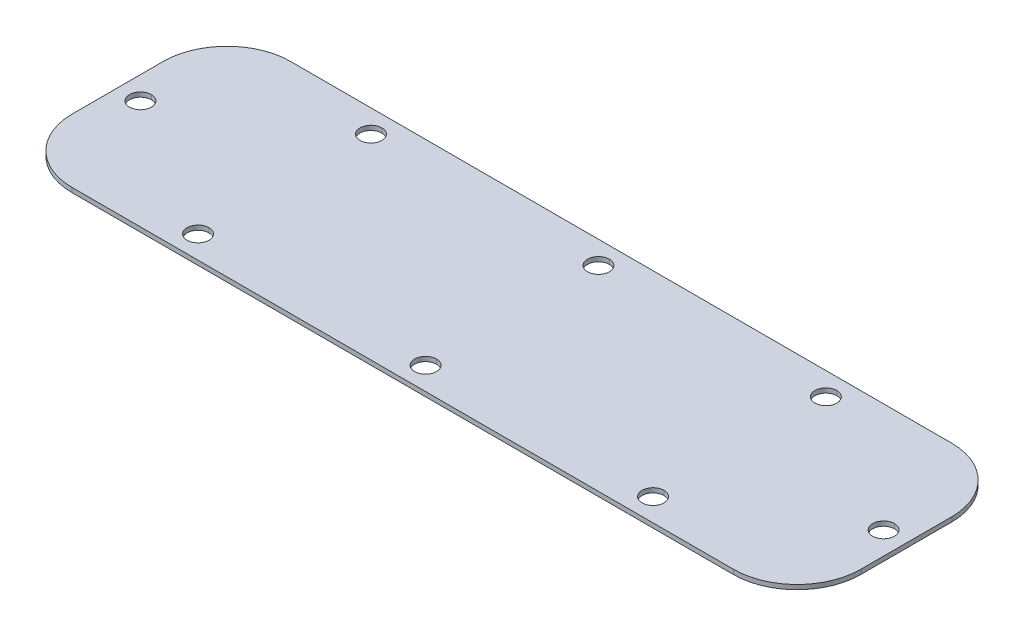
ISO-10303-21;
HEADER;
FILE_DESCRIPTION(('STEP AP214'),'2;1');
FILE_NAME('part.step','',(''),(''),'','','');
FILE_SCHEMA(('AUTOMOTIVE_DESIGN { 1 0 10303 214 1 1 1 1 }'));
ENDSEC;
DATA;
#1=APPLICATION_CONTEXT('core data for automotive mechanical design processes');
#2=APPLICATION_PROTOCOL_DEFINITION('international standard','automotive_design',2000,#1);
#3=PRODUCT_CONTEXT('',#1,'mechanical');
#4=PRODUCT('Part','Part','',(#3));
#5=PRODUCT_RELATED_PRODUCT_CATEGORY('part','',(#4));
#6=PRODUCT_DEFINITION_FORMATION('','',#4);
#7=PRODUCT_DEFINITION_CONTEXT('part definition',#1,'design');
#8=PRODUCT_DEFINITION('design','',#6,#7);
#9=PRODUCT_DEFINITION_SHAPE('','',#8);
#10=(LENGTH_UNIT() NAMED_UNIT(*) SI_UNIT(.MILLI.,.METRE.));
#11=(NAMED_UNIT(*) PLANE_ANGLE_UNIT() SI_UNIT($,.RADIAN.));
#12=(NAMED_UNIT(*) SI_UNIT($,.STERADIAN.) SOLID_ANGLE_UNIT());
#13=UNCERTAINTY_MEASURE_WITH_UNIT(LENGTH_MEASURE(1.E-05),#10,'distance_accuracy_value','');
#14=(GEOMETRIC_REPRESENTATION_CONTEXT(3) GLOBAL_UNCERTAINTY_ASSIGNED_CONTEXT((#13)) GLOBAL_UNIT_ASSIGNED_CONTEXT((#10,
#11,#12)) REPRESENTATION_CONTEXT('',''));
#15=CARTESIAN_POINT('',(0.,0.,0.));
#16=DIRECTION('',(0.,0.,1.));
#17=DIRECTION('',(1.,0.,0.));
#18=AXIS2_PLACEMENT_3D('',#15,#16,#17);
#19=CARTESIAN_POINT('',(-130.,1.5,-15.));
#20=DIRECTION('',(1.,0.,0.));
#21=DIRECTION('',(0.,0.,-1.));
#22=AXIS2_PLACEMENT_3D('',#19,#20,#21);
#23=PLANE('',#22);
#24=DIRECTION('',(0.,0.,1.));
#25=VECTOR('',#24,1.);
#26=CARTESIAN_POINT('',(-130.,0.,-15.));
#27=LINE('',#26,#25);
#28=CARTESIAN_POINT('',(-130.,0.,-15.));
#29=VERTEX_POINT('',#28);
#30=CARTESIAN_POINT('',(-130.,0.,15.));
#31=VERTEX_POINT('',#30);
#32=EDGE_CURVE('E11',#29,#31,#27,.T.);
#33=ORIENTED_EDGE('',*,*,#32,.T.);
#34=DIRECTION('',(0.,-1.,0.));
#35=VECTOR('',#34,1.);
#36=CARTESIAN_POINT('',(-130.,1.5,15.));
#37=LINE('',#36,#35);
#38=CARTESIAN_POINT('',(-130.,1.5,15.));
#39=VERTEX_POINT('',#38);
#40=EDGE_CURVE('E28',#39,#31,#37,.T.);
#41=ORIENTED_EDGE('',*,*,#40,.F.);
#42=DIRECTION('',(0.,0.,1.));
#43=VECTOR('',#42,1.);
#44=CARTESIAN_POINT('',(-130.,1.5,-15.));
#45=LINE('',#44,#43);
#46=CARTESIAN_POINT('',(-130.,1.5,-15.));
#47=VERTEX_POINT('',#46);
#48=EDGE_CURVE('E1168',#47,#39,#45,.T.);
#49=ORIENTED_EDGE('',*,*,#48,.F.);
#50=DIRECTION('',(0.,-1.,0.));
#51=VECTOR('',#50,1.);
#52=CARTESIAN_POINT('',(-130.,1.5,-15.));
#53=LINE('',#52,#51);
#54=EDGE_CURVE('E659',#47,#29,#53,.T.);
#55=ORIENTED_EDGE('',*,*,#54,.T.);
#56=EDGE_LOOP('',(#33,#41,#49,#55));
#57=FACE_BOUND('',#56,.T.);
#58=ADVANCED_FACE('F19',(#57),#23,.F.);
#59=CARTESIAN_POINT('',(-109.000000000003,1.5,-15.0000000000034));
#60=DIRECTION('',(0.,-1.,0.));
#61=DIRECTION('',(0.707106781186549,0.,0.707106781186546));
#62=AXIS2_PLACEMENT_3D('',#59,#60,#61);
#63=CYLINDRICAL_SURFACE('',#62,20.9999999999966);
#64=CARTESIAN_POINT('',(-109.000000000003,0.,-15.0000000000034));
#65=DIRECTION('',(0.,1.,0.));
#66=DIRECTION('',(1.,0.,0.));
#67=AXIS2_PLACEMENT_3D('',#64,#65,#66);
#68=CIRCLE('',#67,20.9999999999966);
#69=CARTESIAN_POINT('',(-109.,0.,-36.));
#70=VERTEX_POINT('',#69);
#71=EDGE_CURVE('E653',#70,#29,#68,.T.);
#72=ORIENTED_EDGE('',*,*,#71,.T.);
#73=ORIENTED_EDGE('',*,*,#54,.F.);
#74=CARTESIAN_POINT('',(-109.000000000003,1.5,-15.0000000000034));
#75=DIRECTION('',(0.,1.,0.));
#76=DIRECTION('',(1.,0.,0.));
#77=AXIS2_PLACEMENT_3D('',#74,#75,#76);
#78=CIRCLE('',#77,20.9999999999966);
#79=CARTESIAN_POINT('',(-109.,1.5,-36.));
#80=VERTEX_POINT('',#79);
#81=EDGE_CURVE('E648',#80,#47,#78,.T.);
#82=ORIENTED_EDGE('',*,*,#81,.F.);
#83=DIRECTION('',(0.,-1.,0.));
#84=VECTOR('',#83,1.);
#85=CARTESIAN_POINT('',(-109.,1.5,-36.));
#86=LINE('',#85,#84);
#87=EDGE_CURVE('E642',#80,#70,#86,.T.);
#88=ORIENTED_EDGE('',*,*,#87,.T.);
#89=EDGE_LOOP('',(#72,#73,#82,#88));
#90=FACE_BOUND('',#89,.T.);
#91=ADVANCED_FACE('F776',(#90),#63,.T.);
#92=CARTESIAN_POINT('',(109.,1.5,-36.));
#93=DIRECTION('',(0.,0.,1.));
#94=DIRECTION('',(1.,0.,0.));
#95=AXIS2_PLACEMENT_3D('',#92,#93,#94);
#96=PLANE('',#95);
#97=DIRECTION('',(-1.,0.,0.));
#98=VECTOR('',#97,1.);
#99=CARTESIAN_POINT('',(109.,0.,-36.));
#100=LINE('',#99,#98);
#101=CARTESIAN_POINT('',(109.,0.,-36.));
#102=VERTEX_POINT('',#101);
#103=EDGE_CURVE('E632',#102,#70,#100,.T.);
#104=ORIENTED_EDGE('',*,*,#103,.T.);
#105=ORIENTED_EDGE('',*,*,#87,.F.);
#106=DIRECTION('',(-1.,0.,0.));
#107=VECTOR('',#106,1.);
#108=CARTESIAN_POINT('',(109.,1.5,-36.));
#109=LINE('',#108,#107);
#110=CARTESIAN_POINT('',(109.,1.5,-36.));
#111=VERTEX_POINT('',#110);
#112=EDGE_CURVE('E618',#111,#80,#109,.T.);
#113=ORIENTED_EDGE('',*,*,#112,.F.);
#114=DIRECTION('',(0.,-1.,0.));
#115=VECTOR('',#114,1.);
#116=CARTESIAN_POINT('',(109.,1.5,-36.));
#117=LINE('',#116,#115);
#118=EDGE_CURVE('E622',#111,#102,#117,.T.);
#119=ORIENTED_EDGE('',*,*,#118,.T.);
#120=EDGE_LOOP('',(#104,#105,#113,#119));
#121=FACE_BOUND('',#120,.T.);
#122=ADVANCED_FACE('F780',(#121),#96,.F.);
#123=CARTESIAN_POINT('',(109.000000000003,1.5,-15.0000000000034));
#124=DIRECTION('',(0.,-1.,0.));
#125=DIRECTION('',(-0.707106781186549,0.,0.707106781186547));
#126=AXIS2_PLACEMENT_3D('',#123,#124,#125);
#127=CYLINDRICAL_SURFACE('',#126,20.9999999999966);
#128=CARTESIAN_POINT('',(109.000000000003,0.,-15.0000000000034));
#129=DIRECTION('',(0.,1.,0.));
#130=DIRECTION('',(1.,0.,0.));
#131=AXIS2_PLACEMENT_3D('',#128,#129,#130);
#132=CIRCLE('',#131,20.9999999999966);
#133=CARTESIAN_POINT('',(130.,0.,-15.));
#134=VERTEX_POINT('',#133);
#135=EDGE_CURVE('E607',#134,#102,#132,.T.);
#136=ORIENTED_EDGE('',*,*,#135,.T.);
#137=ORIENTED_EDGE('',*,*,#118,.F.);
#138=CARTESIAN_POINT('',(109.000000000003,1.5,-15.0000000000034));
#139=DIRECTION('',(0.,1.,0.));
#140=DIRECTION('',(1.,0.,0.));
#141=AXIS2_PLACEMENT_3D('',#138,#139,#140);
#142=CIRCLE('',#141,20.9999999999966);
#143=CARTESIAN_POINT('',(130.,1.5,-15.));
#144=VERTEX_POINT('',#143);
#145=EDGE_CURVE('E615',#144,#111,#142,.T.);
#146=ORIENTED_EDGE('',*,*,#145,.F.);
#147=DIRECTION('',(0.,-1.,0.));
#148=VECTOR('',#147,1.);
#149=CARTESIAN_POINT('',(130.,1.5,-15.));
#150=LINE('',#149,#148);
#151=EDGE_CURVE('E560',#144,#134,#150,.T.);
#152=ORIENTED_EDGE('',*,*,#151,.T.);
#153=EDGE_LOOP('',(#136,#137,#146,#152));
#154=FACE_BOUND('',#153,.T.);
#155=ADVANCED_FACE('F623',(#154),#127,.T.);
#156=CARTESIAN_POINT('',(130.,1.5,15.));
#157=DIRECTION('',(-1.,0.,0.));
#158=DIRECTION('',(0.,0.,1.));
#159=AXIS2_PLACEMENT_3D('',#156,#157,#158);
#160=PLANE('',#159);
#161=DIRECTION('',(0.,0.,-1.));
#162=VECTOR('',#161,1.);
#163=CARTESIAN_POINT('',(130.,0.,15.));
#164=LINE('',#163,#162);
#165=CARTESIAN_POINT('',(130.,0.,15.));
#166=VERTEX_POINT('',#165);
#167=EDGE_CURVE('E554',#166,#134,#164,.T.);
#168=ORIENTED_EDGE('',*,*,#167,.T.);
#169=ORIENTED_EDGE('',*,*,#151,.F.);
#170=DIRECTION('',(0.,0.,-1.));
#171=VECTOR('',#170,1.);
#172=CARTESIAN_POINT('',(130.,1.5,15.));
#173=LINE('',#172,#171);
#174=CARTESIAN_POINT('',(130.,1.5,15.));
#175=VERTEX_POINT('',#174);
#176=EDGE_CURVE('E548',#175,#144,#173,.T.);
#177=ORIENTED_EDGE('',*,*,#176,.F.);
#178=DIRECTION('',(0.,-1.,0.));
#179=VECTOR('',#178,1.);
#180=CARTESIAN_POINT('',(130.,1.5,15.));
#181=LINE('',#180,#179);
#182=EDGE_CURVE('E544',#175,#166,#181,.T.);
#183=ORIENTED_EDGE('',*,*,#182,.T.);
#184=EDGE_LOOP('',(#168,#169,#177,#183));
#185=FACE_BOUND('',#184,.T.);
#186=ADVANCED_FACE('F610',(#185),#160,.F.);
#187=CARTESIAN_POINT('',(109.000000000005,1.5,15.0000000000051));
#188=DIRECTION('',(0.,-1.,0.));
#189=DIRECTION('',(-0.70710678118655,0.,-0.707106781186545));
#190=AXIS2_PLACEMENT_3D('',#187,#188,#189);
#191=CYLINDRICAL_SURFACE('',#190,20.9999999999948);
#192=CARTESIAN_POINT('',(109.000000000005,0.,15.0000000000051));
#193=DIRECTION('',(0.,1.,0.));
#194=DIRECTION('',(1.,0.,0.));
#195=AXIS2_PLACEMENT_3D('',#192,#193,#194);
#196=CIRCLE('',#195,20.9999999999948);
#197=CARTESIAN_POINT('',(109.,0.,36.));
#198=VERTEX_POINT('',#197);
#199=EDGE_CURVE('E542',#198,#166,#196,.T.);
#200=ORIENTED_EDGE('',*,*,#199,.T.);
#201=ORIENTED_EDGE('',*,*,#182,.F.);
#202=CARTESIAN_POINT('',(109.000000000005,1.5,15.0000000000051));
#203=DIRECTION('',(0.,1.,0.));
#204=DIRECTION('',(1.,0.,0.));
#205=AXIS2_PLACEMENT_3D('',#202,#203,#204);
#206=CIRCLE('',#205,20.9999999999948);
#207=CARTESIAN_POINT('',(109.,1.5,36.));
#208=VERTEX_POINT('',#207);
#209=EDGE_CURVE('E581',#208,#175,#206,.T.);
#210=ORIENTED_EDGE('',*,*,#209,.F.);
#211=DIRECTION('',(0.,-1.,0.));
#212=VECTOR('',#211,1.);
#213=CARTESIAN_POINT('',(109.,1.5,36.));
#214=LINE('',#213,#212);
#215=EDGE_CURVE('E577',#208,#198,#214,.T.);
#216=ORIENTED_EDGE('',*,*,#215,.T.);
#217=EDGE_LOOP('',(#200,#201,#210,#216));
#218=FACE_BOUND('',#217,.T.);
#219=ADVANCED_FACE('F599',(#218),#191,.T.);
#220=CARTESIAN_POINT('',(-109.,1.5,36.));
#221=DIRECTION('',(0.,0.,-1.));
#222=DIRECTION('',(-1.,0.,0.));
#223=AXIS2_PLACEMENT_3D('',#220,#221,#222);
#224=PLANE('',#223);
#225=DIRECTION('',(1.,0.,0.));
#226=VECTOR('',#225,1.);
#227=CARTESIAN_POINT('',(-109.,0.,36.));
#228=LINE('',#227,#226);
#229=CARTESIAN_POINT('',(-109.,0.,36.));
#230=VERTEX_POINT('',#229);
#231=EDGE_CURVE('E575',#230,#198,#228,.T.);
#232=ORIENTED_EDGE('',*,*,#231,.T.);
#233=ORIENTED_EDGE('',*,*,#215,.F.);
#234=DIRECTION('',(1.,0.,0.));
#235=VECTOR('',#234,1.);
#236=CARTESIAN_POINT('',(-109.,1.5,36.));
#237=LINE('',#236,#235);
#238=CARTESIAN_POINT('',(-109.,1.5,36.));
#239=VERTEX_POINT('',#238);
#240=EDGE_CURVE('E799',#239,#208,#237,.T.);
#241=ORIENTED_EDGE('',*,*,#240,.F.);
#242=DIRECTION('',(0.,-1.,0.));
#243=VECTOR('',#242,1.);
#244=CARTESIAN_POINT('',(-109.,1.5,36.));
#245=LINE('',#244,#243);
#246=EDGE_CURVE('E529',#239,#230,#245,.T.);
#247=ORIENTED_EDGE('',*,*,#246,.T.);
#248=EDGE_LOOP('',(#232,#233,#241,#247));
#249=FACE_BOUND('',#248,.T.);
#250=ADVANCED_FACE('F771',(#249),#224,.F.);
#251=CARTESIAN_POINT('',(-109.000000000003,1.5,15.0000000000034));
#252=DIRECTION('',(0.,-1.,0.));
#253=DIRECTION('',(0.707106781186548,0.,-0.707106781186547));
#254=AXIS2_PLACEMENT_3D('',#251,#252,#253);
#255=CYLINDRICAL_SURFACE('',#254,20.9999999999966);
#256=CARTESIAN_POINT('',(-109.000000000003,0.,15.0000000000034));
#257=DIRECTION('',(0.,1.,0.));
#258=DIRECTION('',(1.,0.,0.));
#259=AXIS2_PLACEMENT_3D('',#256,#257,#258);
#260=CIRCLE('',#259,20.9999999999966);
#261=EDGE_CURVE('E523',#31,#230,#260,.T.);
#262=ORIENTED_EDGE('',*,*,#261,.T.);
#263=ORIENTED_EDGE('',*,*,#246,.F.);
#264=CARTESIAN_POINT('',(-109.000000000003,1.5,15.0000000000034));
#265=DIRECTION('',(0.,1.,0.));
#266=DIRECTION('',(1.,0.,0.));
#267=AXIS2_PLACEMENT_3D('',#264,#265,#266);
#268=CIRCLE('',#267,20.9999999999966);
#269=EDGE_CURVE('E516',#39,#239,#268,.T.);
#270=ORIENTED_EDGE('',*,*,#269,.F.);
#271=ORIENTED_EDGE('',*,*,#40,.T.);
#272=EDGE_LOOP('',(#262,#263,#270,#271));
#273=FACE_BOUND('',#272,.T.);
#274=ADVANCED_FACE('F763',(#273),#255,.T.);
#275=CARTESIAN_POINT('',(-109.000000000003,1.5,15.0000000000034));
#276=DIRECTION('',(0.,1.,0.));
#277=DIRECTION('',(0.,0.,1.));
#278=AXIS2_PLACEMENT_3D('',#275,#276,#277);
#279=PLANE('',#278);
#280=CARTESIAN_POINT('',(-122.5,1.5,0.));
#281=DIRECTION('',(0.,1.,0.));
#282=DIRECTION('',(0.,0.,1.));
#283=AXIS2_PLACEMENT_3D('',#280,#281,#282);
#284=CIRCLE('',#283,3.6);
#285=CARTESIAN_POINT('',(-122.5,1.5,3.6));
#286=VERTEX_POINT('',#285);
#287=CARTESIAN_POINT('',(-122.5,1.5,-3.6));
#288=VERTEX_POINT('',#287);
#289=EDGE_CURVE('E324',#286,#288,#284,.T.);
#290=ORIENTED_EDGE('',*,*,#289,.F.);
#291=CARTESIAN_POINT('',(-122.5,1.5,0.));
#292=DIRECTION('',(0.,1.,0.));
#293=DIRECTION('',(1.,0.,0.));
#294=AXIS2_PLACEMENT_3D('',#291,#292,#293);
#295=CIRCLE('',#294,3.6);
#296=EDGE_CURVE('E329',#288,#286,#295,.T.);
#297=ORIENTED_EDGE('',*,*,#296,.F.);
#298=EDGE_LOOP('',(#290,#297));
#299=FACE_BOUND('',#298,.T.);
#300=CARTESIAN_POINT('',(-75.,1.5,-28.5));
#301=DIRECTION('',(0.,1.,0.));
#302=DIRECTION('',(0.,0.,1.));
#303=AXIS2_PLACEMENT_3D('',#300,#301,#302);
#304=CIRCLE('',#303,3.6);
#305=CARTESIAN_POINT('',(-75.,1.5,-24.9));
#306=VERTEX_POINT('',#305);
#307=CARTESIAN_POINT('',(-75.,1.5,-32.1));
#308=VERTEX_POINT('',#307);
#309=EDGE_CURVE('E509',#306,#308,#304,.T.);
#310=ORIENTED_EDGE('',*,*,#309,.F.);
#311=CARTESIAN_POINT('',(-75.,1.5,-28.5));
#312=DIRECTION('',(0.,1.,0.));
#313=DIRECTION('',(1.,0.,0.));
#314=AXIS2_PLACEMENT_3D('',#311,#312,#313);
#315=CIRCLE('',#314,3.6);
#316=EDGE_CURVE('E496',#308,#306,#315,.T.);
#317=ORIENTED_EDGE('',*,*,#316,.F.);
#318=EDGE_LOOP('',(#310,#317));
#319=FACE_BOUND('',#318,.T.);
#320=CARTESIAN_POINT('',(-75.,1.5,28.5));
#321=DIRECTION('',(0.,1.,0.));
#322=DIRECTION('',(0.,0.,1.));
#323=AXIS2_PLACEMENT_3D('',#320,#321,#322);
#324=CIRCLE('',#323,3.6);
#325=CARTESIAN_POINT('',(-75.,1.5,32.1));
#326=VERTEX_POINT('',#325);
#327=CARTESIAN_POINT('',(-75.,1.5,24.9));
#328=VERTEX_POINT('',#327);
#329=EDGE_CURVE('E491',#326,#328,#324,.T.);
#330=ORIENTED_EDGE('',*,*,#329,.F.);
#331=CARTESIAN_POINT('',(-75.,1.5,28.5));
#332=DIRECTION('',(0.,1.,0.));
#333=DIRECTION('',(1.,0.,0.));
#334=AXIS2_PLACEMENT_3D('',#331,#332,#333);
#335=CIRCLE('',#334,3.6);
#336=EDGE_CURVE('E485',#328,#326,#335,.T.);
#337=ORIENTED_EDGE('',*,*,#336,.F.);
#338=EDGE_LOOP('',(#330,#337));
#339=FACE_BOUND('',#338,.T.);
#340=CARTESIAN_POINT('',(0.,1.5,-28.5));
#341=DIRECTION('',(0.,1.,0.));
#342=DIRECTION('',(0.,0.,1.));
#343=AXIS2_PLACEMENT_3D('',#340,#341,#342);
#344=CIRCLE('',#343,3.6);
#345=CARTESIAN_POINT('',(0.,1.5,-24.9));
#346=VERTEX_POINT('',#345);
#347=CARTESIAN_POINT('',(0.,1.5,-32.1));
#348=VERTEX_POINT('',#347);
#349=EDGE_CURVE('E481',#346,#348,#344,.T.);
#350=ORIENTED_EDGE('',*,*,#349,.F.);
#351=CARTESIAN_POINT('',(0.,1.5,-28.5));
#352=DIRECTION('',(0.,1.,0.));
#353=DIRECTION('',(1.,0.,0.));
#354=AXIS2_PLACEMENT_3D('',#351,#352,#353);
#355=CIRCLE('',#354,3.6);
#356=EDGE_CURVE('E476',#348,#346,#355,.T.);
#357=ORIENTED_EDGE('',*,*,#356,.F.);
#358=EDGE_LOOP('',(#350,#357));
#359=FACE_BOUND('',#358,.T.);
#360=CARTESIAN_POINT('',(0.,1.5,28.5));
#361=DIRECTION('',(0.,1.,0.));
#362=DIRECTION('',(0.,0.,1.));
#363=AXIS2_PLACEMENT_3D('',#360,#361,#362);
#364=CIRCLE('',#363,3.6);
#365=CARTESIAN_POINT('',(0.,1.5,32.1));
#366=VERTEX_POINT('',#365);
#367=CARTESIAN_POINT('',(0.,1.5,24.9));
#368=VERTEX_POINT('',#367);
#369=EDGE_CURVE('E475',#366,#368,#364,.T.);
#370=ORIENTED_EDGE('',*,*,#369,.F.);
#371=CARTESIAN_POINT('',(0.,1.5,28.5));
#372=DIRECTION('',(0.,1.,0.));
#373=DIRECTION('',(1.,0.,0.));
#374=AXIS2_PLACEMENT_3D('',#371,#372,#373);
#375=CIRCLE('',#374,3.6);
#376=EDGE_CURVE('E454',#368,#366,#375,.T.);
#377=ORIENTED_EDGE('',*,*,#376,.F.);
#378=EDGE_LOOP('',(#370,#377));
#379=FACE_BOUND('',#378,.T.);
#380=CARTESIAN_POINT('',(75.,1.5,-28.5));
#381=DIRECTION('',(0.,1.,0.));
#382=DIRECTION('',(0.,0.,1.));
#383=AXIS2_PLACEMENT_3D('',#380,#381,#382);
#384=CIRCLE('',#383,3.6);
#385=CARTESIAN_POINT('',(75.,1.5,-24.9));
#386=VERTEX_POINT('',#385);
#387=CARTESIAN_POINT('',(75.,1.5,-32.1));
#388=VERTEX_POINT('',#387);
#389=EDGE_CURVE('E447',#386,#388,#384,.T.);
#390=ORIENTED_EDGE('',*,*,#389,.F.);
#391=CARTESIAN_POINT('',(75.,1.5,-28.5));
#392=DIRECTION('',(0.,1.,0.));
#393=DIRECTION('',(1.,0.,0.));
#394=AXIS2_PLACEMENT_3D('',#391,#392,#393);
#395=CIRCLE('',#394,3.6);
#396=EDGE_CURVE('E444',#388,#386,#395,.T.);
#397=ORIENTED_EDGE('',*,*,#396,.F.);
#398=EDGE_LOOP('',(#390,#397));
#399=FACE_BOUND('',#398,.T.);
#400=CARTESIAN_POINT('',(75.,1.5,28.5));
#401=DIRECTION('',(0.,1.,0.));
#402=DIRECTION('',(0.,0.,1.));
#403=AXIS2_PLACEMENT_3D('',#400,#401,#402);
#404=CIRCLE('',#403,3.6);
#405=CARTESIAN_POINT('',(75.,1.5,32.1));
#406=VERTEX_POINT('',#405);
#407=CARTESIAN_POINT('',(75.,1.5,24.9));
#408=VERTEX_POINT('',#407);
#409=EDGE_CURVE('E448',#406,#408,#404,.T.);
#410=ORIENTED_EDGE('',*,*,#409,.F.);
#411=CARTESIAN_POINT('',(75.,1.5,28.5));
#412=DIRECTION('',(0.,1.,0.));
#413=DIRECTION('',(1.,0.,0.));
#414=AXIS2_PLACEMENT_3D('',#411,#412,#413);
#415=CIRCLE('',#414,3.6);
#416=EDGE_CURVE('E198',#408,#406,#415,.T.);
#417=ORIENTED_EDGE('',*,*,#416,.F.);
#418=EDGE_LOOP('',(#410,#417));
#419=FACE_BOUND('',#418,.T.);
#420=CARTESIAN_POINT('',(122.5,1.5,0.));
#421=DIRECTION('',(0.,1.,0.));
#422=DIRECTION('',(0.,0.,1.));
#423=AXIS2_PLACEMENT_3D('',#420,#421,#422);
#424=CIRCLE('',#423,3.6);
#425=CARTESIAN_POINT('',(122.5,1.5,3.6));
#426=VERTEX_POINT('',#425);
#427=CARTESIAN_POINT('',(122.5,1.5,-3.6));
#428=VERTEX_POINT('',#427);
#429=EDGE_CURVE('E688',#426,#428,#424,.T.);
#430=ORIENTED_EDGE('',*,*,#429,.F.);
#431=CARTESIAN_POINT('',(122.5,1.5,0.));
#432=DIRECTION('',(0.,1.,0.));
#433=DIRECTION('',(1.,0.,0.));
#434=AXIS2_PLACEMENT_3D('',#431,#432,#433);
#435=CIRCLE('',#434,3.6);
#436=EDGE_CURVE('E681',#428,#426,#435,.T.);
#437=ORIENTED_EDGE('',*,*,#436,.F.);
#438=EDGE_LOOP('',(#430,#437));
#439=FACE_BOUND('',#438,.T.);
#440=ORIENTED_EDGE('',*,*,#48,.T.);
#441=ORIENTED_EDGE('',*,*,#269,.T.);
#442=ORIENTED_EDGE('',*,*,#240,.T.);
#443=ORIENTED_EDGE('',*,*,#209,.T.);
#444=ORIENTED_EDGE('',*,*,#176,.T.);
#445=ORIENTED_EDGE('',*,*,#145,.T.);
#446=ORIENTED_EDGE('',*,*,#112,.T.);
#447=ORIENTED_EDGE('',*,*,#81,.T.);
#448=EDGE_LOOP('',(#440,#441,#442,#443,#444,#445,#446,#447));
#449=FACE_BOUND('',#448,.T.);
#450=ADVANCED_FACE('F613',(#299,#319,#339,#359,#379,#399,#419,#439,#449),#279,.T.);
#451=CARTESIAN_POINT('',(122.5,1.5,0.));
#452=DIRECTION('',(0.,-1.,0.));
#453=DIRECTION('',(1.,0.,0.));
#454=AXIS2_PLACEMENT_3D('',#451,#452,#453);
#455=CYLINDRICAL_SURFACE('',#454,3.6);
#456=DIRECTION('',(0.,-1.,0.));
#457=VECTOR('',#456,1.);
#458=CARTESIAN_POINT('',(122.5,1.5,3.6));
#459=LINE('',#458,#457);
#460=CARTESIAN_POINT('',(122.5,0.,3.6));
#461=VERTEX_POINT('',#460);
#462=EDGE_CURVE('E677',#426,#461,#459,.T.);
#463=ORIENTED_EDGE('',*,*,#462,.T.);
#464=CARTESIAN_POINT('',(122.5,0.,0.));
#465=DIRECTION('',(0.,1.,0.));
#466=DIRECTION('',(1.,0.,0.));
#467=AXIS2_PLACEMENT_3D('',#464,#465,#466);
#468=CIRCLE('',#467,3.6);
#469=CARTESIAN_POINT('',(122.5,0.,-3.6));
#470=VERTEX_POINT('',#469);
#471=EDGE_CURVE('E671',#470,#461,#468,.T.);
#472=ORIENTED_EDGE('',*,*,#471,.F.);
#473=DIRECTION('',(0.,-1.,0.));
#474=VECTOR('',#473,1.);
#475=CARTESIAN_POINT('',(122.5,1.5,-3.6));
#476=LINE('',#475,#474);
#477=EDGE_CURVE('E666',#428,#470,#476,.T.);
#478=ORIENTED_EDGE('',*,*,#477,.F.);
#479=ORIENTED_EDGE('',*,*,#436,.T.);
#480=EDGE_LOOP('',(#463,#472,#478,#479));
#481=FACE_BOUND('',#480,.T.);
#482=ADVANCED_FACE('F760',(#481),#455,.F.);
#483=CARTESIAN_POINT('',(122.5,1.5,0.));
#484=DIRECTION('',(0.,-1.,0.));
#485=DIRECTION('',(-1.,0.,0.));
#486=AXIS2_PLACEMENT_3D('',#483,#484,#485);
#487=CYLINDRICAL_SURFACE('',#486,3.6);
#488=ORIENTED_EDGE('',*,*,#462,.F.);
#489=ORIENTED_EDGE('',*,*,#429,.T.);
#490=ORIENTED_EDGE('',*,*,#477,.T.);
#491=CARTESIAN_POINT('',(122.5,0.,0.));
#492=DIRECTION('',(0.,1.,0.));
#493=DIRECTION('',(0.,0.,1.));
#494=AXIS2_PLACEMENT_3D('',#491,#492,#493);
#495=CIRCLE('',#494,3.6);
#496=EDGE_CURVE('E339',#461,#470,#495,.T.);
#497=ORIENTED_EDGE('',*,*,#496,.F.);
#498=EDGE_LOOP('',(#488,#489,#490,#497));
#499=FACE_BOUND('',#498,.T.);
#500=ADVANCED_FACE('F757',(#499),#487,.F.);
#501=CARTESIAN_POINT('',(-109.000000000003,0.,15.0000000000034));
#502=DIRECTION('',(0.,1.,0.));
#503=DIRECTION('',(0.,0.,1.));
#504=AXIS2_PLACEMENT_3D('',#501,#502,#503);
#505=PLANE('',#504);
#506=CARTESIAN_POINT('',(-122.5,0.,0.));
#507=DIRECTION('',(0.,1.,0.));
#508=DIRECTION('',(0.,0.,1.));
#509=AXIS2_PLACEMENT_3D('',#506,#507,#508);
#510=CIRCLE('',#509,3.6);
#511=CARTESIAN_POINT('',(-122.5,0.,3.6));
#512=VERTEX_POINT('',#511);
#513=CARTESIAN_POINT('',(-122.5,0.,-3.6));
#514=VERTEX_POINT('',#513);
#515=EDGE_CURVE('E323',#512,#514,#510,.T.);
#516=ORIENTED_EDGE('',*,*,#515,.T.);
#517=CARTESIAN_POINT('',(-122.5,0.,0.));
#518=DIRECTION('',(0.,1.,0.));
#519=DIRECTION('',(1.,0.,0.));
#520=AXIS2_PLACEMENT_3D('',#517,#518,#519);
#521=CIRCLE('',#520,3.6);
#522=EDGE_CURVE('E330',#514,#512,#521,.T.);
#523=ORIENTED_EDGE('',*,*,#522,.T.);
#524=EDGE_LOOP('',(#516,#523));
#525=FACE_BOUND('',#524,.T.);
#526=CARTESIAN_POINT('',(-75.,0.,-28.5));
#527=DIRECTION('',(0.,1.,0.));
#528=DIRECTION('',(0.,0.,1.));
#529=AXIS2_PLACEMENT_3D('',#526,#527,#528);
#530=CIRCLE('',#529,3.6);
#531=CARTESIAN_POINT('',(-75.,0.,-24.9));
#532=VERTEX_POINT('',#531);
#533=CARTESIAN_POINT('',(-75.,0.,-32.1));
#534=VERTEX_POINT('',#533);
#535=EDGE_CURVE('E333',#532,#534,#530,.T.);
#536=ORIENTED_EDGE('',*,*,#535,.T.);
#537=CARTESIAN_POINT('',(-75.,0.,-28.5));
#538=DIRECTION('',(0.,1.,0.));
#539=DIRECTION('',(1.,0.,0.));
#540=AXIS2_PLACEMENT_3D('',#537,#538,#539);
#541=CIRCLE('',#540,3.6);
#542=EDGE_CURVE('E341',#534,#532,#541,.T.);
#543=ORIENTED_EDGE('',*,*,#542,.T.);
#544=EDGE_LOOP('',(#536,#543));
#545=FACE_BOUND('',#544,.T.);
#546=CARTESIAN_POINT('',(-75.,0.,28.5));
#547=DIRECTION('',(0.,1.,0.));
#548=DIRECTION('',(0.,0.,1.));
#549=AXIS2_PLACEMENT_3D('',#546,#547,#548);
#550=CIRCLE('',#549,3.6);
#551=CARTESIAN_POINT('',(-75.,0.,32.1));
#552=VERTEX_POINT('',#551);
#553=CARTESIAN_POINT('',(-75.,0.,24.9));
#554=VERTEX_POINT('',#553);
#555=EDGE_CURVE('E365',#552,#554,#550,.T.);
#556=ORIENTED_EDGE('',*,*,#555,.T.);
#557=CARTESIAN_POINT('',(-75.,0.,28.5));
#558=DIRECTION('',(0.,1.,0.));
#559=DIRECTION('',(1.,0.,0.));
#560=AXIS2_PLACEMENT_3D('',#557,#558,#559);
#561=CIRCLE('',#560,3.6);
#562=EDGE_CURVE('E377',#554,#552,#561,.T.);
#563=ORIENTED_EDGE('',*,*,#562,.T.);
#564=EDGE_LOOP('',(#556,#563));
#565=FACE_BOUND('',#564,.T.);
#566=CARTESIAN_POINT('',(0.,0.,-28.5));
#567=DIRECTION('',(0.,1.,0.));
#568=DIRECTION('',(0.,0.,1.));
#569=AXIS2_PLACEMENT_3D('',#566,#567,#568);
#570=CIRCLE('',#569,3.6);
#571=CARTESIAN_POINT('',(0.,0.,-24.9));
#572=VERTEX_POINT('',#571);
#573=CARTESIAN_POINT('',(0.,0.,-32.1));
#574=VERTEX_POINT('',#573);
#575=EDGE_CURVE('E382',#572,#574,#570,.T.);
#576=ORIENTED_EDGE('',*,*,#575,.T.);
#577=CARTESIAN_POINT('',(0.,0.,-28.5));
#578=DIRECTION('',(0.,1.,0.));
#579=DIRECTION('',(1.,0.,0.));
#580=AXIS2_PLACEMENT_3D('',#577,#578,#579);
#581=CIRCLE('',#580,3.6);
#582=EDGE_CURVE('E387',#574,#572,#581,.T.);
#583=ORIENTED_EDGE('',*,*,#582,.T.);
#584=EDGE_LOOP('',(#576,#583));
#585=FACE_BOUND('',#584,.T.);
#586=CARTESIAN_POINT('',(0.,0.,28.5));
#587=DIRECTION('',(0.,1.,0.));
#588=DIRECTION('',(0.,0.,1.));
#589=AXIS2_PLACEMENT_3D('',#586,#587,#588);
#590=CIRCLE('',#589,3.6);
#591=CARTESIAN_POINT('',(0.,0.,32.1));
#592=VERTEX_POINT('',#591);
#593=CARTESIAN_POINT('',(0.,0.,24.9));
#594=VERTEX_POINT('',#593);
#595=EDGE_CURVE('E397',#592,#594,#590,.T.);
#596=ORIENTED_EDGE('',*,*,#595,.T.);
#597=CARTESIAN_POINT('',(0.,0.,28.5));
#598=DIRECTION('',(0.,1.,0.));
#599=DIRECTION('',(1.,0.,0.));
#600=AXIS2_PLACEMENT_3D('',#597,#598,#599);
#601=CIRCLE('',#600,3.6);
#602=EDGE_CURVE('E412',#594,#592,#601,.T.);
#603=ORIENTED_EDGE('',*,*,#602,.T.);
#604=EDGE_LOOP('',(#596,#603));
#605=FACE_BOUND('',#604,.T.);
#606=CARTESIAN_POINT('',(75.,0.,-28.5));
#607=DIRECTION('',(0.,1.,0.));
#608=DIRECTION('',(0.,0.,1.));
#609=AXIS2_PLACEMENT_3D('',#606,#607,#608);
#610=CIRCLE('',#609,3.6);
#611=CARTESIAN_POINT('',(75.,0.,-24.9));
#612=VERTEX_POINT('',#611);
#613=CARTESIAN_POINT('',(75.,0.,-32.1));
#614=VERTEX_POINT('',#613);
#615=EDGE_CURVE('E410',#612,#614,#610,.T.);
#616=ORIENTED_EDGE('',*,*,#615,.T.);
#617=CARTESIAN_POINT('',(75.,0.,-28.5));
#618=DIRECTION('',(0.,1.,0.));
#619=DIRECTION('',(1.,0.,0.));
#620=AXIS2_PLACEMENT_3D('',#617,#618,#619);
#621=CIRCLE('',#620,3.6);
#622=EDGE_CURVE('E195',#614,#612,#621,.T.);
#623=ORIENTED_EDGE('',*,*,#622,.T.);
#624=EDGE_LOOP('',(#616,#623));
#625=FACE_BOUND('',#624,.T.);
#626=CARTESIAN_POINT('',(75.,0.,28.5));
#627=DIRECTION('',(0.,1.,0.));
#628=DIRECTION('',(0.,0.,1.));
#629=AXIS2_PLACEMENT_3D('',#626,#627,#628);
#630=CIRCLE('',#629,3.6);
#631=CARTESIAN_POINT('',(75.,0.,32.1));
#632=VERTEX_POINT('',#631);
#633=CARTESIAN_POINT('',(75.,0.,24.9));
#634=VERTEX_POINT('',#633);
#635=EDGE_CURVE('E180',#632,#634,#630,.T.);
#636=ORIENTED_EDGE('',*,*,#635,.T.);
#637=CARTESIAN_POINT('',(75.,0.,28.5));
#638=DIRECTION('',(0.,1.,0.));
#639=DIRECTION('',(1.,0.,0.));
#640=AXIS2_PLACEMENT_3D('',#637,#638,#639);
#641=CIRCLE('',#640,3.6);
#642=EDGE_CURVE('E176',#634,#632,#641,.T.);
#643=ORIENTED_EDGE('',*,*,#642,.T.);
#644=EDGE_LOOP('',(#636,#643));
#645=FACE_BOUND('',#644,.T.);
#646=ORIENTED_EDGE('',*,*,#496,.T.);
#647=ORIENTED_EDGE('',*,*,#471,.T.);
#648=EDGE_LOOP('',(#646,#647));
#649=FACE_BOUND('',#648,.T.);
#650=ORIENTED_EDGE('',*,*,#32,.F.);
#651=ORIENTED_EDGE('',*,*,#71,.F.);
#652=ORIENTED_EDGE('',*,*,#103,.F.);
#653=ORIENTED_EDGE('',*,*,#135,.F.);
#654=ORIENTED_EDGE('',*,*,#167,.F.);
#655=ORIENTED_EDGE('',*,*,#199,.F.);
#656=ORIENTED_EDGE('',*,*,#231,.F.);
#657=ORIENTED_EDGE('',*,*,#261,.F.);
#658=EDGE_LOOP('',(#650,#651,#652,#653,#654,#655,#656,#657));
#659=FACE_BOUND('',#658,.T.);
#660=ADVANCED_FACE('F178',(#525,#545,#565,#585,#605,#625,#645,#649,#659),#505,.F.);
#661=CARTESIAN_POINT('',(75.,1.5,28.5));
#662=DIRECTION('',(0.,-1.,0.));
#663=DIRECTION('',(1.,0.,0.));
#664=AXIS2_PLACEMENT_3D('',#661,#662,#663);
#665=CYLINDRICAL_SURFACE('',#664,3.6);
#666=DIRECTION('',(0.,-1.,0.));
#667=VECTOR('',#666,1.);
#668=CARTESIAN_POINT('',(75.,1.5,32.1));
#669=LINE('',#668,#667);
#670=EDGE_CURVE('E186',#406,#632,#669,.T.);
#671=ORIENTED_EDGE('',*,*,#670,.T.);
#672=ORIENTED_EDGE('',*,*,#642,.F.);
#673=DIRECTION('',(0.,-1.,0.));
#674=VECTOR('',#673,1.);
#675=CARTESIAN_POINT('',(75.,1.5,24.9));
#676=LINE('',#675,#674);
#677=EDGE_CURVE('E193',#408,#634,#676,.T.);
#678=ORIENTED_EDGE('',*,*,#677,.F.);
#679=ORIENTED_EDGE('',*,*,#416,.T.);
#680=EDGE_LOOP('',(#671,#672,#678,#679));
#681=FACE_BOUND('',#680,.T.);
#682=ADVANCED_FACE('F197',(#681),#665,.F.);
#683=CARTESIAN_POINT('',(75.,1.5,28.5));
#684=DIRECTION('',(0.,-1.,0.));
#685=DIRECTION('',(-1.,0.,0.));
#686=AXIS2_PLACEMENT_3D('',#683,#684,#685);
#687=CYLINDRICAL_SURFACE('',#686,3.6);
#688=ORIENTED_EDGE('',*,*,#670,.F.);
#689=ORIENTED_EDGE('',*,*,#409,.T.);
#690=ORIENTED_EDGE('',*,*,#677,.T.);
#691=ORIENTED_EDGE('',*,*,#635,.F.);
#692=EDGE_LOOP('',(#688,#689,#690,#691));
#693=FACE_BOUND('',#692,.T.);
#694=ADVANCED_FACE('F190',(#693),#687,.F.);
#695=CARTESIAN_POINT('',(75.,1.5,-28.5));
#696=DIRECTION('',(0.,-1.,0.));
#697=DIRECTION('',(1.,0.,0.));
#698=AXIS2_PLACEMENT_3D('',#695,#696,#697);
#699=CYLINDRICAL_SURFACE('',#698,3.6);
#700=DIRECTION('',(0.,-1.,0.));
#701=VECTOR('',#700,1.);
#702=CARTESIAN_POINT('',(75.,1.5,-24.9));
#703=LINE('',#702,#701);
#704=EDGE_CURVE('E205',#386,#612,#703,.T.);
#705=ORIENTED_EDGE('',*,*,#704,.T.);
#706=ORIENTED_EDGE('',*,*,#622,.F.);
#707=DIRECTION('',(0.,-1.,0.));
#708=VECTOR('',#707,1.);
#709=CARTESIAN_POINT('',(75.,1.5,-32.1));
#710=LINE('',#709,#708);
#711=EDGE_CURVE('E228',#388,#614,#710,.T.);
#712=ORIENTED_EDGE('',*,*,#711,.F.);
#713=ORIENTED_EDGE('',*,*,#396,.T.);
#714=EDGE_LOOP('',(#705,#706,#712,#713));
#715=FACE_BOUND('',#714,.T.);
#716=ADVANCED_FACE('F443',(#715),#699,.F.);
#717=CARTESIAN_POINT('',(75.,1.5,-28.5));
#718=DIRECTION('',(0.,-1.,0.));
#719=DIRECTION('',(-1.,0.,0.));
#720=AXIS2_PLACEMENT_3D('',#717,#718,#719);
#721=CYLINDRICAL_SURFACE('',#720,3.6);
#722=ORIENTED_EDGE('',*,*,#704,.F.);
#723=ORIENTED_EDGE('',*,*,#389,.T.);
#724=ORIENTED_EDGE('',*,*,#711,.T.);
#725=ORIENTED_EDGE('',*,*,#615,.F.);
#726=EDGE_LOOP('',(#722,#723,#724,#725));
#727=FACE_BOUND('',#726,.T.);
#728=ADVANCED_FACE('F440',(#727),#721,.F.);
#729=CARTESIAN_POINT('',(0.,1.5,28.5));
#730=DIRECTION('',(0.,-1.,0.));
#731=DIRECTION('',(1.,0.,0.));
#732=AXIS2_PLACEMENT_3D('',#729,#730,#731);
#733=CYLINDRICAL_SURFACE('',#732,3.6);
#734=DIRECTION('',(0.,-1.,0.));
#735=VECTOR('',#734,1.);
#736=CARTESIAN_POINT('',(0.,1.5,32.1));
#737=LINE('',#736,#735);
#738=EDGE_CURVE('E233',#366,#592,#737,.T.);
#739=ORIENTED_EDGE('',*,*,#738,.T.);
#740=ORIENTED_EDGE('',*,*,#602,.F.);
#741=DIRECTION('',(0.,-1.,0.));
#742=VECTOR('',#741,1.);
#743=CARTESIAN_POINT('',(0.,1.5,24.9));
#744=LINE('',#743,#742);
#745=EDGE_CURVE('E240',#368,#594,#744,.T.);
#746=ORIENTED_EDGE('',*,*,#745,.F.);
#747=ORIENTED_EDGE('',*,*,#376,.T.);
#748=EDGE_LOOP('',(#739,#740,#746,#747));
#749=FACE_BOUND('',#748,.T.);
#750=ADVANCED_FACE('F847',(#749),#733,.F.);
#751=CARTESIAN_POINT('',(0.,1.5,28.5));
#752=DIRECTION('',(0.,-1.,0.));
#753=DIRECTION('',(-1.,0.,0.));
#754=AXIS2_PLACEMENT_3D('',#751,#752,#753);
#755=CYLINDRICAL_SURFACE('',#754,3.6);
#756=ORIENTED_EDGE('',*,*,#738,.F.);
#757=ORIENTED_EDGE('',*,*,#369,.T.);
#758=ORIENTED_EDGE('',*,*,#745,.T.);
#759=ORIENTED_EDGE('',*,*,#595,.F.);
#760=EDGE_LOOP('',(#756,#757,#758,#759));
#761=FACE_BOUND('',#760,.T.);
#762=ADVANCED_FACE('F851',(#761),#755,.F.);
#763=CARTESIAN_POINT('',(0.,1.5,-28.5));
#764=DIRECTION('',(0.,-1.,0.));
#765=DIRECTION('',(1.,0.,0.));
#766=AXIS2_PLACEMENT_3D('',#763,#764,#765);
#767=CYLINDRICAL_SURFACE('',#766,3.6);
#768=DIRECTION('',(0.,-1.,0.));
#769=VECTOR('',#768,1.);
#770=CARTESIAN_POINT('',(0.,1.5,-24.9));
#771=LINE('',#770,#769);
#772=EDGE_CURVE('E246',#346,#572,#771,.T.);
#773=ORIENTED_EDGE('',*,*,#772,.T.);
#774=ORIENTED_EDGE('',*,*,#582,.F.);
#775=DIRECTION('',(0.,-1.,0.));
#776=VECTOR('',#775,1.);
#777=CARTESIAN_POINT('',(0.,1.5,-32.1));
#778=LINE('',#777,#776);
#779=EDGE_CURVE('E259',#348,#574,#778,.T.);
#780=ORIENTED_EDGE('',*,*,#779,.F.);
#781=ORIENTED_EDGE('',*,*,#356,.T.);
#782=EDGE_LOOP('',(#773,#774,#780,#781));
#783=FACE_BOUND('',#782,.T.);
#784=ADVANCED_FACE('F871',(#783),#767,.F.);
#785=CARTESIAN_POINT('',(0.,1.5,-28.5));
#786=DIRECTION('',(0.,-1.,0.));
#787=DIRECTION('',(-1.,0.,0.));
#788=AXIS2_PLACEMENT_3D('',#785,#786,#787);
#789=CYLINDRICAL_SURFACE('',#788,3.6);
#790=ORIENTED_EDGE('',*,*,#772,.F.);
#791=ORIENTED_EDGE('',*,*,#349,.T.);
#792=ORIENTED_EDGE('',*,*,#779,.T.);
#793=ORIENTED_EDGE('',*,*,#575,.F.);
#794=EDGE_LOOP('',(#790,#791,#792,#793));
#795=FACE_BOUND('',#794,.T.);
#796=ADVANCED_FACE('F874',(#795),#789,.F.);
#797=CARTESIAN_POINT('',(-75.,1.5,28.5));
#798=DIRECTION('',(0.,-1.,0.));
#799=DIRECTION('',(1.,0.,0.));
#800=AXIS2_PLACEMENT_3D('',#797,#798,#799);
#801=CYLINDRICAL_SURFACE('',#800,3.6);
#802=DIRECTION('',(0.,-1.,0.));
#803=VECTOR('',#802,1.);
#804=CARTESIAN_POINT('',(-75.,1.5,32.1));
#805=LINE('',#804,#803);
#806=EDGE_CURVE('E257',#326,#552,#805,.T.);
#807=ORIENTED_EDGE('',*,*,#806,.T.);
#808=ORIENTED_EDGE('',*,*,#562,.F.);
#809=DIRECTION('',(0.,-1.,0.));
#810=VECTOR('',#809,1.);
#811=CARTESIAN_POINT('',(-75.,1.5,24.9));
#812=LINE('',#811,#810);
#813=EDGE_CURVE('E274',#328,#554,#812,.T.);
#814=ORIENTED_EDGE('',*,*,#813,.F.);
#815=ORIENTED_EDGE('',*,*,#336,.T.);
#816=EDGE_LOOP('',(#807,#808,#814,#815));
#817=FACE_BOUND('',#816,.T.);
#818=ADVANCED_FACE('F878',(#817),#801,.F.);
#819=CARTESIAN_POINT('',(-75.,1.5,28.5));
#820=DIRECTION('',(0.,-1.,0.));
#821=DIRECTION('',(-1.,0.,0.));
#822=AXIS2_PLACEMENT_3D('',#819,#820,#821);
#823=CYLINDRICAL_SURFACE('',#822,3.6);
#824=ORIENTED_EDGE('',*,*,#806,.F.);
#825=ORIENTED_EDGE('',*,*,#329,.T.);
#826=ORIENTED_EDGE('',*,*,#813,.T.);
#827=ORIENTED_EDGE('',*,*,#555,.F.);
#828=EDGE_LOOP('',(#824,#825,#826,#827));
#829=FACE_BOUND('',#828,.T.);
#830=ADVANCED_FACE('F881',(#829),#823,.F.);
#831=CARTESIAN_POINT('',(-75.,1.5,-28.5));
#832=DIRECTION('',(0.,-1.,0.));
#833=DIRECTION('',(1.,0.,0.));
#834=AXIS2_PLACEMENT_3D('',#831,#832,#833);
#835=CYLINDRICAL_SURFACE('',#834,3.6);
#836=DIRECTION('',(0.,-1.,0.));
#837=VECTOR('',#836,1.);
#838=CARTESIAN_POINT('',(-75.,1.5,-24.9));
#839=LINE('',#838,#837);
#840=EDGE_CURVE('E283',#306,#532,#839,.T.);
#841=ORIENTED_EDGE('',*,*,#840,.T.);
#842=ORIENTED_EDGE('',*,*,#542,.F.);
#843=DIRECTION('',(0.,-1.,0.));
#844=VECTOR('',#843,1.);
#845=CARTESIAN_POINT('',(-75.,1.5,-32.1));
#846=LINE('',#845,#844);
#847=EDGE_CURVE('E293',#308,#534,#846,.T.);
#848=ORIENTED_EDGE('',*,*,#847,.F.);
#849=ORIENTED_EDGE('',*,*,#316,.T.);
#850=EDGE_LOOP('',(#841,#842,#848,#849));
#851=FACE_BOUND('',#850,.T.);
#852=ADVANCED_FACE('F884',(#851),#835,.F.);
#853=CARTESIAN_POINT('',(-75.,1.5,-28.5));
#854=DIRECTION('',(0.,-1.,0.));
#855=DIRECTION('',(-1.,0.,0.));
#856=AXIS2_PLACEMENT_3D('',#853,#854,#855);
#857=CYLINDRICAL_SURFACE('',#856,3.6);
#858=ORIENTED_EDGE('',*,*,#840,.F.);
#859=ORIENTED_EDGE('',*,*,#309,.T.);
#860=ORIENTED_EDGE('',*,*,#847,.T.);
#861=ORIENTED_EDGE('',*,*,#535,.F.);
#862=EDGE_LOOP('',(#858,#859,#860,#861));
#863=FACE_BOUND('',#862,.T.);
#864=ADVANCED_FACE('F887',(#863),#857,.F.);
#865=CARTESIAN_POINT('',(-122.5,1.5,0.));
#866=DIRECTION('',(0.,-1.,0.));
#867=DIRECTION('',(1.,0.,0.));
#868=AXIS2_PLACEMENT_3D('',#865,#866,#867);
#869=CYLINDRICAL_SURFACE('',#868,3.6);
#870=DIRECTION('',(0.,-1.,0.));
#871=VECTOR('',#870,1.);
#872=CARTESIAN_POINT('',(-122.5,1.5,3.6));
#873=LINE('',#872,#871);
#874=EDGE_CURVE('E303',#286,#512,#873,.T.);
#875=ORIENTED_EDGE('',*,*,#874,.T.);
#876=ORIENTED_EDGE('',*,*,#522,.F.);
#877=DIRECTION('',(0.,-1.,0.));
#878=VECTOR('',#877,1.);
#879=CARTESIAN_POINT('',(-122.5,1.5,-3.6));
#880=LINE('',#879,#878);
#881=EDGE_CURVE('E310',#288,#514,#880,.T.);
#882=ORIENTED_EDGE('',*,*,#881,.F.);
#883=ORIENTED_EDGE('',*,*,#296,.T.);
#884=EDGE_LOOP('',(#875,#876,#882,#883));
#885=FACE_BOUND('',#884,.T.);
#886=ADVANCED_FACE('F328',(#885),#869,.F.);
#887=CARTESIAN_POINT('',(-122.5,1.5,0.));
#888=DIRECTION('',(0.,-1.,0.));
#889=DIRECTION('',(-1.,0.,0.));
#890=AXIS2_PLACEMENT_3D('',#887,#888,#889);
#891=CYLINDRICAL_SURFACE('',#890,3.6);
#892=ORIENTED_EDGE('',*,*,#874,.F.);
#893=ORIENTED_EDGE('',*,*,#289,.T.);
#894=ORIENTED_EDGE('',*,*,#881,.T.);
#895=ORIENTED_EDGE('',*,*,#515,.F.);
#896=EDGE_LOOP('',(#892,#893,#894,#895));
#897=FACE_BOUND('',#896,.T.);
#898=ADVANCED_FACE('F322',(#897),#891,.F.);
#899=CLOSED_SHELL('',(#58,#91,#122,#155,#186,#219,#250,#274,#450,#482,#500,#660,#682,#694,#716,
#728,#750,#762,#784,#796,#818,#830,#852,#864,#886,#898));
#900=MANIFOLD_SOLID_BREP('B1',#899);
#901=ADVANCED_BREP_SHAPE_REPRESENTATION('',(#18,#900),#14);
#902=SHAPE_DEFINITION_REPRESENTATION(#9,#901);
ENDSEC;
END-ISO-10303-21;
